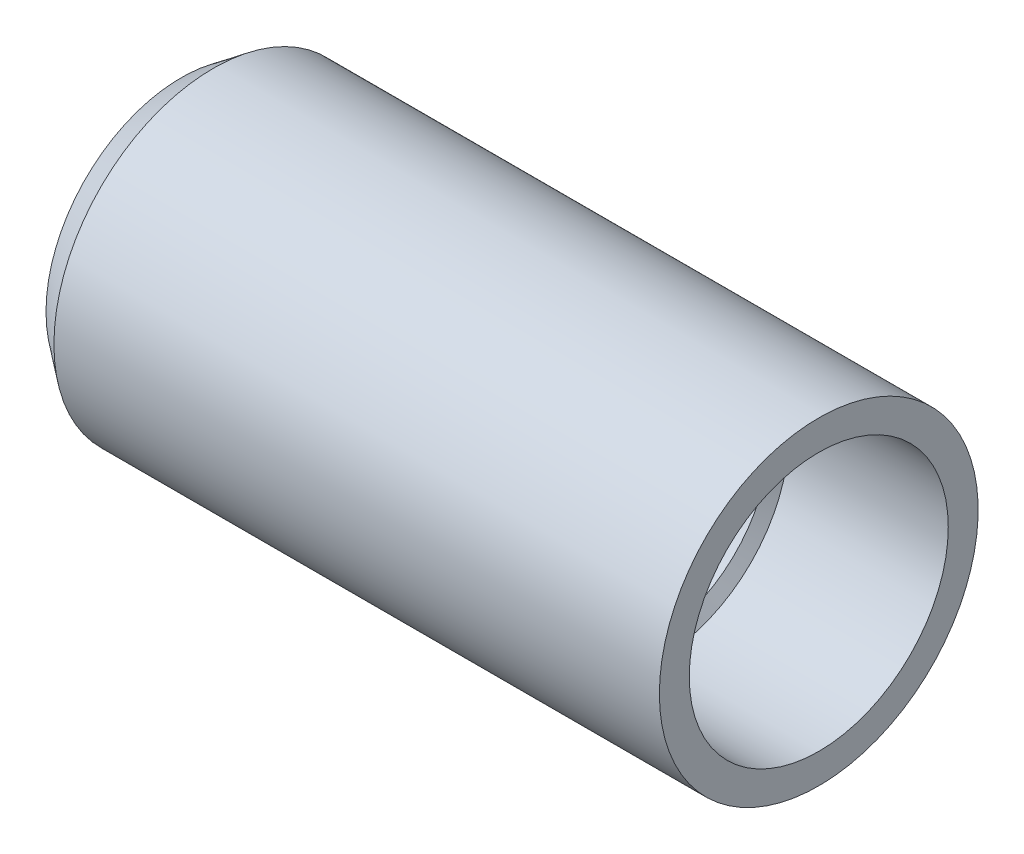
ISO-10303-21;
HEADER;
FILE_DESCRIPTION(('STEP AP214'),'2;1');
FILE_NAME('part.step','',(''),(''),'','','');
FILE_SCHEMA(('AUTOMOTIVE_DESIGN { 1 0 10303 214 1 1 1 1 }'));
ENDSEC;
DATA;
#1=APPLICATION_CONTEXT('core data for automotive mechanical design processes');
#2=APPLICATION_PROTOCOL_DEFINITION('international standard','automotive_design',2000,#1);
#3=PRODUCT_CONTEXT('',#1,'mechanical');
#4=PRODUCT('Part','Part','',(#3));
#5=PRODUCT_RELATED_PRODUCT_CATEGORY('part','',(#4));
#6=PRODUCT_DEFINITION_FORMATION('','',#4);
#7=PRODUCT_DEFINITION_CONTEXT('part definition',#1,'design');
#8=PRODUCT_DEFINITION('design','',#6,#7);
#9=PRODUCT_DEFINITION_SHAPE('','',#8);
#10=(LENGTH_UNIT() NAMED_UNIT(*) SI_UNIT(.MILLI.,.METRE.));
#11=(NAMED_UNIT(*) PLANE_ANGLE_UNIT() SI_UNIT($,.RADIAN.));
#12=(NAMED_UNIT(*) SI_UNIT($,.STERADIAN.) SOLID_ANGLE_UNIT());
#13=UNCERTAINTY_MEASURE_WITH_UNIT(LENGTH_MEASURE(1.E-05),#10,'distance_accuracy_value','');
#14=(GEOMETRIC_REPRESENTATION_CONTEXT(3) GLOBAL_UNCERTAINTY_ASSIGNED_CONTEXT((#13)) GLOBAL_UNIT_ASSIGNED_CONTEXT((#10,
#11,#12)) REPRESENTATION_CONTEXT('',''));
#15=CARTESIAN_POINT('',(0.,0.,0.));
#16=DIRECTION('',(0.,0.,1.));
#17=DIRECTION('',(1.,0.,0.));
#18=AXIS2_PLACEMENT_3D('',#15,#16,#17);
#19=CARTESIAN_POINT('',(50.8,12.7,0.));
#20=DIRECTION('',(-1.,0.,0.));
#21=DIRECTION('',(0.,0.,1.));
#22=AXIS2_PLACEMENT_3D('',#19,#20,#21);
#23=PLANE('',#22);
#24=CARTESIAN_POINT('',(50.8,0.,0.));
#25=DIRECTION('',(-1.,0.,0.));
#26=DIRECTION('',(0.,0.,1.));
#27=AXIS2_PLACEMENT_3D('',#24,#25,#26);
#28=CIRCLE('',#27,12.7);
#29=CARTESIAN_POINT('',(50.8,0.,12.7));
#30=VERTEX_POINT('',#29);
#31=EDGE_CURVE('E55',#30,#30,#28,.T.);
#32=ORIENTED_EDGE('',*,*,#31,.F.);
#33=EDGE_LOOP('',(#32));
#34=FACE_BOUND('',#33,.T.);
#35=CARTESIAN_POINT('',(50.8,0.,0.));
#36=DIRECTION('',(1.,0.,0.));
#37=DIRECTION('',(0.,0.,-1.));
#38=AXIS2_PLACEMENT_3D('',#35,#36,#37);
#39=CIRCLE('',#38,10.31875);
#40=CARTESIAN_POINT('',(50.8,0.,-10.31875));
#41=VERTEX_POINT('',#40);
#42=EDGE_CURVE('E77',#41,#41,#39,.T.);
#43=ORIENTED_EDGE('',*,*,#42,.F.);
#44=EDGE_LOOP('',(#43));
#45=FACE_BOUND('',#44,.T.);
#46=ADVANCED_FACE('F41',(#34,#45),#23,.F.);
#47=CARTESIAN_POINT('',(0.,5.55625,0.));
#48=DIRECTION('',(1.,0.,0.));
#49=DIRECTION('',(0.,0.,-1.));
#50=AXIS2_PLACEMENT_3D('',#47,#48,#49);
#51=PLANE('',#50);
#52=CARTESIAN_POINT('',(0.,0.,0.));
#53=DIRECTION('',(-1.,0.,0.));
#54=DIRECTION('',(0.,0.,1.));
#55=AXIS2_PLACEMENT_3D('',#52,#53,#54);
#56=CIRCLE('',#55,5.55625);
#57=CARTESIAN_POINT('',(0.,0.,5.55625));
#58=VERTEX_POINT('',#57);
#59=EDGE_CURVE('E69',#58,#58,#56,.T.);
#60=ORIENTED_EDGE('',*,*,#59,.F.);
#61=EDGE_LOOP('',(#60));
#62=FACE_BOUND('',#61,.T.);
#63=CARTESIAN_POINT('',(0.,0.,0.));
#64=DIRECTION('',(-1.,0.,0.));
#65=DIRECTION('',(0.,0.,1.));
#66=AXIS2_PLACEMENT_3D('',#63,#64,#65);
#67=CIRCLE('',#66,10.7716630624277);
#68=CARTESIAN_POINT('',(0.,0.,10.7716630624277));
#69=VERTEX_POINT('',#68);
#70=EDGE_CURVE('E10',#69,#69,#67,.T.);
#71=ORIENTED_EDGE('',*,*,#70,.T.);
#72=EDGE_LOOP('',(#71));
#73=FACE_BOUND('',#72,.T.);
#74=ADVANCED_FACE('F43',(#62,#73),#51,.F.);
#75=CARTESIAN_POINT('',(2.55898954734468,0.,0.));
#76=DIRECTION('',(1.,0.,0.));
#77=DIRECTION('',(0.,0.,-1.));
#78=AXIS2_PLACEMENT_3D('',#75,#76,#77);
#79=CONICAL_SURFACE('',#78,12.7,0.645771823237904);
#80=ORIENTED_EDGE('',*,*,#70,.F.);
#81=EDGE_LOOP('',(#80));
#82=FACE_BOUND('',#81,.T.);
#83=CARTESIAN_POINT('',(2.55898954734468,0.,0.));
#84=DIRECTION('',(-1.,0.,0.));
#85=DIRECTION('',(0.,0.,1.));
#86=AXIS2_PLACEMENT_3D('',#83,#84,#85);
#87=CIRCLE('',#86,12.7);
#88=CARTESIAN_POINT('',(2.55898954734468,0.,12.7));
#89=VERTEX_POINT('',#88);
#90=EDGE_CURVE('E50',#89,#89,#87,.T.);
#91=ORIENTED_EDGE('',*,*,#90,.T.);
#92=EDGE_LOOP('',(#91));
#93=FACE_BOUND('',#92,.T.);
#94=ADVANCED_FACE('F90',(#82,#93),#79,.T.);
#95=CARTESIAN_POINT('',(0.,0.,0.));
#96=DIRECTION('',(-1.,0.,0.));
#97=DIRECTION('',(0.,0.,1.));
#98=AXIS2_PLACEMENT_3D('',#95,#96,#97);
#99=CYLINDRICAL_SURFACE('',#98,12.7);
#100=ORIENTED_EDGE('',*,*,#90,.F.);
#101=EDGE_LOOP('',(#100));
#102=FACE_BOUND('',#101,.T.);
#103=ORIENTED_EDGE('',*,*,#31,.T.);
#104=EDGE_LOOP('',(#103));
#105=FACE_BOUND('',#104,.T.);
#106=ADVANCED_FACE('F97',(#102,#105),#99,.T.);
#107=CARTESIAN_POINT('',(0.,0.,0.));
#108=DIRECTION('',(-1.,0.,0.));
#109=DIRECTION('',(0.,0.,1.));
#110=AXIS2_PLACEMENT_3D('',#107,#108,#109);
#111=CYLINDRICAL_SURFACE('',#110,9.35355);
#112=CARTESIAN_POINT('',(37.5200493305146,0.,0.));
#113=DIRECTION('',(1.,0.,0.));
#114=DIRECTION('',(0.,0.,-1.));
#115=AXIS2_PLACEMENT_3D('',#112,#113,#114);
#116=CIRCLE('',#115,9.35355);
#117=CARTESIAN_POINT('',(37.5200493305146,0.,-9.35355));
#118=VERTEX_POINT('',#117);
#119=EDGE_CURVE('E45',#118,#118,#116,.T.);
#120=ORIENTED_EDGE('',*,*,#119,.T.);
#121=EDGE_LOOP('',(#120));
#122=FACE_BOUND('',#121,.T.);
#123=CARTESIAN_POINT('',(25.4,0.,0.));
#124=DIRECTION('',(-1.,0.,0.));
#125=DIRECTION('',(0.,0.,1.));
#126=AXIS2_PLACEMENT_3D('',#123,#124,#125);
#127=CIRCLE('',#126,9.35355);
#128=CARTESIAN_POINT('',(25.4,0.,9.35355));
#129=VERTEX_POINT('',#128);
#130=EDGE_CURVE('E61',#129,#129,#127,.T.);
#131=ORIENTED_EDGE('',*,*,#130,.T.);
#132=EDGE_LOOP('',(#131));
#133=FACE_BOUND('',#132,.T.);
#134=ADVANCED_FACE('F95',(#122,#133),#111,.F.);
#135=CARTESIAN_POINT('',(25.4,9.35355,0.));
#136=DIRECTION('',(-1.,0.,0.));
#137=DIRECTION('',(0.,0.,1.));
#138=AXIS2_PLACEMENT_3D('',#135,#136,#137);
#139=PLANE('',#138);
#140=ORIENTED_EDGE('',*,*,#130,.F.);
#141=EDGE_LOOP('',(#140));
#142=FACE_BOUND('',#141,.T.);
#143=CARTESIAN_POINT('',(25.4,0.,0.));
#144=DIRECTION('',(-1.,0.,0.));
#145=DIRECTION('',(0.,0.,1.));
#146=AXIS2_PLACEMENT_3D('',#143,#144,#145);
#147=CIRCLE('',#146,5.55625);
#148=CARTESIAN_POINT('',(25.4,0.,5.55625));
#149=VERTEX_POINT('',#148);
#150=EDGE_CURVE('E65',#149,#149,#147,.T.);
#151=ORIENTED_EDGE('',*,*,#150,.T.);
#152=EDGE_LOOP('',(#151));
#153=FACE_BOUND('',#152,.T.);
#154=ADVANCED_FACE('F120',(#142,#153),#139,.F.);
#155=CARTESIAN_POINT('',(0.,0.,0.));
#156=DIRECTION('',(-1.,0.,0.));
#157=DIRECTION('',(0.,0.,1.));
#158=AXIS2_PLACEMENT_3D('',#155,#156,#157);
#159=CYLINDRICAL_SURFACE('',#158,5.55625);
#160=ORIENTED_EDGE('',*,*,#150,.F.);
#161=EDGE_LOOP('',(#160));
#162=FACE_BOUND('',#161,.T.);
#163=ORIENTED_EDGE('',*,*,#59,.T.);
#164=EDGE_LOOP('',(#163));
#165=FACE_BOUND('',#164,.T.);
#166=ADVANCED_FACE('F128',(#162,#165),#159,.F.);
#167=CARTESIAN_POINT('',(38.1,0.,0.));
#168=DIRECTION('',(1.,0.,0.));
#169=DIRECTION('',(0.,0.,-1.));
#170=AXIS2_PLACEMENT_3D('',#167,#168,#169);
#171=CONICAL_SURFACE('',#170,10.31875,1.02974425867665);
#172=CARTESIAN_POINT('',(38.1,0.,0.));
#173=DIRECTION('',(1.,0.,0.));
#174=DIRECTION('',(0.,0.,-1.));
#175=AXIS2_PLACEMENT_3D('',#172,#173,#174);
#176=CIRCLE('',#175,10.31875);
#177=CARTESIAN_POINT('',(38.1,0.,-10.31875));
#178=VERTEX_POINT('',#177);
#179=EDGE_CURVE('E73',#178,#178,#176,.T.);
#180=ORIENTED_EDGE('',*,*,#179,.T.);
#181=EDGE_LOOP('',(#180));
#182=FACE_BOUND('',#181,.T.);
#183=ORIENTED_EDGE('',*,*,#119,.F.);
#184=EDGE_LOOP('',(#183));
#185=FACE_BOUND('',#184,.T.);
#186=ADVANCED_FACE('F135',(#182,#185),#171,.F.);
#187=CARTESIAN_POINT('',(50.8,0.,0.));
#188=DIRECTION('',(1.,0.,0.));
#189=DIRECTION('',(0.,0.,-1.));
#190=AXIS2_PLACEMENT_3D('',#187,#188,#189);
#191=CYLINDRICAL_SURFACE('',#190,10.31875);
#192=ORIENTED_EDGE('',*,*,#179,.F.);
#193=EDGE_LOOP('',(#192));
#194=FACE_BOUND('',#193,.T.);
#195=ORIENTED_EDGE('',*,*,#42,.T.);
#196=EDGE_LOOP('',(#195));
#197=FACE_BOUND('',#196,.T.);
#198=ADVANCED_FACE('F82',(#194,#197),#191,.F.);
#199=CLOSED_SHELL('',(#46,#74,#94,#106,#134,#154,#166,#186,#198));
#200=MANIFOLD_SOLID_BREP('B2',#199);
#201=ADVANCED_BREP_SHAPE_REPRESENTATION('',(#18,#200),#14);
#202=SHAPE_DEFINITION_REPRESENTATION(#9,#201);
ENDSEC;
END-ISO-10303-21;
